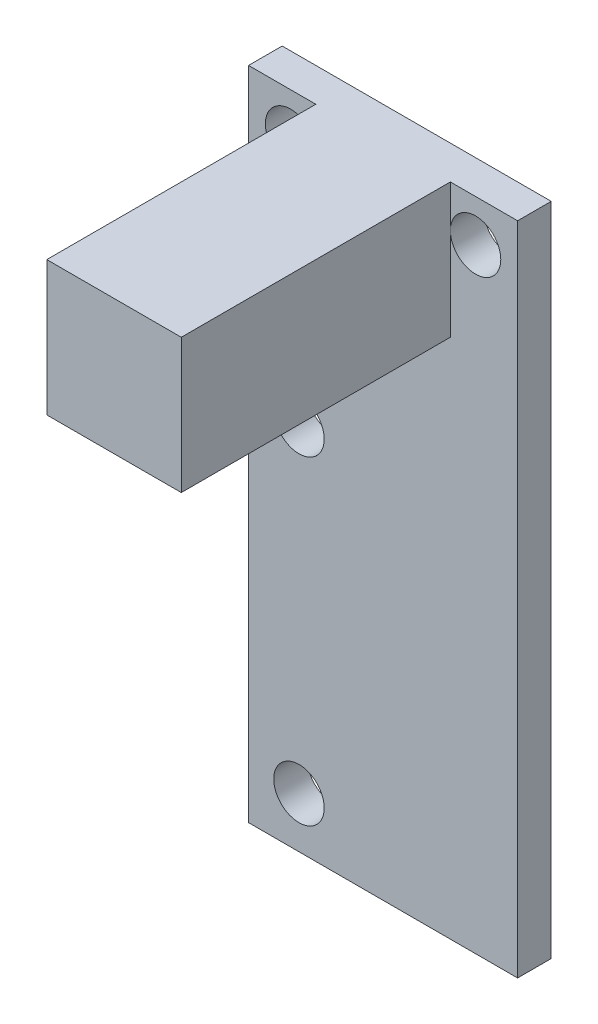
ISO-10303-21;
HEADER;
FILE_DESCRIPTION(('STEP AP214'),'2;1');
FILE_NAME('part.step','',(''),(''),'','','');
FILE_SCHEMA(('AUTOMOTIVE_DESIGN { 1 0 10303 214 1 1 1 1 }'));
ENDSEC;
DATA;
#1=APPLICATION_CONTEXT('core data for automotive mechanical design processes');
#2=APPLICATION_PROTOCOL_DEFINITION('international standard','automotive_design',2000,#1);
#3=PRODUCT_CONTEXT('',#1,'mechanical');
#4=PRODUCT('Part','Part','',(#3));
#5=PRODUCT_RELATED_PRODUCT_CATEGORY('part','',(#4));
#6=PRODUCT_DEFINITION_FORMATION('','',#4);
#7=PRODUCT_DEFINITION_CONTEXT('part definition',#1,'design');
#8=PRODUCT_DEFINITION('design','',#6,#7);
#9=PRODUCT_DEFINITION_SHAPE('','',#8);
#10=(LENGTH_UNIT() NAMED_UNIT(*) SI_UNIT(.MILLI.,.METRE.));
#11=(NAMED_UNIT(*) PLANE_ANGLE_UNIT() SI_UNIT($,.RADIAN.));
#12=(NAMED_UNIT(*) SI_UNIT($,.STERADIAN.) SOLID_ANGLE_UNIT());
#13=UNCERTAINTY_MEASURE_WITH_UNIT(LENGTH_MEASURE(1.E-05),#10,'distance_accuracy_value','');
#14=(GEOMETRIC_REPRESENTATION_CONTEXT(3) GLOBAL_UNCERTAINTY_ASSIGNED_CONTEXT((#13)) GLOBAL_UNIT_ASSIGNED_CONTEXT((#10,
#11,#12)) REPRESENTATION_CONTEXT('',''));
#15=CARTESIAN_POINT('',(0.,0.,0.));
#16=DIRECTION('',(0.,0.,1.));
#17=DIRECTION('',(1.,0.,0.));
#18=AXIS2_PLACEMENT_3D('',#15,#16,#17);
#19=CARTESIAN_POINT('',(16.,0.,0.));
#20=DIRECTION('',(1.,0.,0.));
#21=DIRECTION('',(0.,0.,-1.));
#22=AXIS2_PLACEMENT_3D('',#19,#20,#21);
#23=PLANE('',#22);
#24=DIRECTION('',(0.,1.,0.));
#25=VECTOR('',#24,1.);
#26=CARTESIAN_POINT('',(16.,0.,2.));
#27=LINE('',#26,#25);
#28=CARTESIAN_POINT('',(16.,0.,2.));
#29=VERTEX_POINT('',#28);
#30=CARTESIAN_POINT('',(16.,39.,2.));
#31=VERTEX_POINT('',#30);
#32=EDGE_CURVE('E128',#29,#31,#27,.T.);
#33=ORIENTED_EDGE('',*,*,#32,.F.);
#34=DIRECTION('',(0.,0.,1.));
#35=VECTOR('',#34,1.);
#36=CARTESIAN_POINT('',(16.,0.,0.));
#37=LINE('',#36,#35);
#38=CARTESIAN_POINT('',(16.,0.,0.));
#39=VERTEX_POINT('',#38);
#40=EDGE_CURVE('E11',#39,#29,#37,.T.);
#41=ORIENTED_EDGE('',*,*,#40,.F.);
#42=DIRECTION('',(0.,1.,0.));
#43=VECTOR('',#42,1.);
#44=CARTESIAN_POINT('',(16.,0.,0.));
#45=LINE('',#44,#43);
#46=CARTESIAN_POINT('',(16.,39.,0.));
#47=VERTEX_POINT('',#46);
#48=EDGE_CURVE('E139',#39,#47,#45,.T.);
#49=ORIENTED_EDGE('',*,*,#48,.T.);
#50=DIRECTION('',(0.,0.,1.));
#51=VECTOR('',#50,1.);
#52=CARTESIAN_POINT('',(16.,39.,0.));
#53=LINE('',#52,#51);
#54=EDGE_CURVE('E151',#47,#31,#53,.T.);
#55=ORIENTED_EDGE('',*,*,#54,.T.);
#56=EDGE_LOOP('',(#33,#41,#49,#55));
#57=FACE_BOUND('',#56,.T.);
#58=ADVANCED_FACE('F32',(#57),#23,.T.);
#59=CARTESIAN_POINT('',(0.,0.,0.));
#60=DIRECTION('',(0.,-1.,0.));
#61=DIRECTION('',(0.,0.,-1.));
#62=AXIS2_PLACEMENT_3D('',#59,#60,#61);
#63=PLANE('',#62);
#64=DIRECTION('',(1.,0.,0.));
#65=VECTOR('',#64,1.);
#66=CARTESIAN_POINT('',(0.,0.,2.));
#67=LINE('',#66,#65);
#68=CARTESIAN_POINT('',(0.,0.,2.));
#69=VERTEX_POINT('',#68);
#70=EDGE_CURVE('E143',#69,#29,#67,.T.);
#71=ORIENTED_EDGE('',*,*,#70,.F.);
#72=DIRECTION('',(0.,0.,1.));
#73=VECTOR('',#72,1.);
#74=CARTESIAN_POINT('',(0.,0.,0.));
#75=LINE('',#74,#73);
#76=CARTESIAN_POINT('',(0.,0.,0.));
#77=VERTEX_POINT('',#76);
#78=EDGE_CURVE('E41',#77,#69,#75,.T.);
#79=ORIENTED_EDGE('',*,*,#78,.F.);
#80=DIRECTION('',(1.,0.,0.));
#81=VECTOR('',#80,1.);
#82=CARTESIAN_POINT('',(0.,0.,0.));
#83=LINE('',#82,#81);
#84=EDGE_CURVE('E149',#77,#39,#83,.T.);
#85=ORIENTED_EDGE('',*,*,#84,.T.);
#86=ORIENTED_EDGE('',*,*,#40,.T.);
#87=EDGE_LOOP('',(#71,#79,#85,#86));
#88=FACE_BOUND('',#87,.T.);
#89=ADVANCED_FACE('F178',(#88),#63,.T.);
#90=CARTESIAN_POINT('',(0.,39.,0.));
#91=DIRECTION('',(-1.,0.,0.));
#92=DIRECTION('',(0.,-1.,0.));
#93=AXIS2_PLACEMENT_3D('',#90,#91,#92);
#94=PLANE('',#93);
#95=DIRECTION('',(0.,-1.,0.));
#96=VECTOR('',#95,1.);
#97=CARTESIAN_POINT('',(0.,39.,2.));
#98=LINE('',#97,#96);
#99=CARTESIAN_POINT('',(0.,39.,2.));
#100=VERTEX_POINT('',#99);
#101=EDGE_CURVE('E155',#100,#69,#98,.T.);
#102=ORIENTED_EDGE('',*,*,#101,.F.);
#103=DIRECTION('',(0.,0.,1.));
#104=VECTOR('',#103,1.);
#105=CARTESIAN_POINT('',(0.,39.,0.));
#106=LINE('',#105,#104);
#107=CARTESIAN_POINT('',(0.,39.,0.));
#108=VERTEX_POINT('',#107);
#109=EDGE_CURVE('E165',#108,#100,#106,.T.);
#110=ORIENTED_EDGE('',*,*,#109,.F.);
#111=DIRECTION('',(0.,-1.,0.));
#112=VECTOR('',#111,1.);
#113=CARTESIAN_POINT('',(0.,39.,0.));
#114=LINE('',#113,#112);
#115=EDGE_CURVE('E146',#108,#77,#114,.T.);
#116=ORIENTED_EDGE('',*,*,#115,.T.);
#117=ORIENTED_EDGE('',*,*,#78,.T.);
#118=EDGE_LOOP('',(#102,#110,#116,#117));
#119=FACE_BOUND('',#118,.T.);
#120=ADVANCED_FACE('F250',(#119),#94,.T.);
#121=CARTESIAN_POINT('',(16.,39.,0.));
#122=DIRECTION('',(0.,1.,0.));
#123=DIRECTION('',(0.,0.,1.));
#124=AXIS2_PLACEMENT_3D('',#121,#122,#123);
#125=PLANE('',#124);
#126=DIRECTION('',(-1.,0.,0.));
#127=VECTOR('',#126,1.);
#128=CARTESIAN_POINT('',(16.,39.,2.));
#129=LINE('',#128,#127);
#130=CARTESIAN_POINT('',(12.,39.,2.));
#131=VERTEX_POINT('',#130);
#132=EDGE_CURVE('E161',#31,#131,#129,.T.);
#133=ORIENTED_EDGE('',*,*,#132,.F.);
#134=ORIENTED_EDGE('',*,*,#54,.F.);
#135=DIRECTION('',(-1.,0.,0.));
#136=VECTOR('',#135,1.);
#137=CARTESIAN_POINT('',(16.,39.,0.));
#138=LINE('',#137,#136);
#139=EDGE_CURVE('E142',#47,#108,#138,.T.);
#140=ORIENTED_EDGE('',*,*,#139,.T.);
#141=ORIENTED_EDGE('',*,*,#109,.T.);
#142=CARTESIAN_POINT('',(3.99999999999999,39.,2.));
#143=VERTEX_POINT('',#142);
#144=EDGE_CURVE('E131',#143,#100,#129,.T.);
#145=ORIENTED_EDGE('',*,*,#144,.F.);
#146=DIRECTION('',(0.,0.,-1.));
#147=VECTOR('',#146,1.);
#148=CARTESIAN_POINT('',(3.99999999999999,39.,18.));
#149=LINE('',#148,#147);
#150=CARTESIAN_POINT('',(3.99999999999999,39.,18.));
#151=VERTEX_POINT('',#150);
#152=EDGE_CURVE('E133',#151,#143,#149,.T.);
#153=ORIENTED_EDGE('',*,*,#152,.F.);
#154=DIRECTION('',(-1.,0.,0.));
#155=VECTOR('',#154,1.);
#156=CARTESIAN_POINT('',(3.99999999999999,39.,18.));
#157=LINE('',#156,#155);
#158=CARTESIAN_POINT('',(12.,39.,18.));
#159=VERTEX_POINT('',#158);
#160=EDGE_CURVE('E113',#159,#151,#157,.T.);
#161=ORIENTED_EDGE('',*,*,#160,.F.);
#162=DIRECTION('',(0.,0.,-1.));
#163=VECTOR('',#162,1.);
#164=CARTESIAN_POINT('',(12.,39.,18.));
#165=LINE('',#164,#163);
#166=EDGE_CURVE('E110',#159,#131,#165,.T.);
#167=ORIENTED_EDGE('',*,*,#166,.T.);
#168=EDGE_LOOP('',(#133,#134,#140,#141,#145,#153,#161,#167));
#169=FACE_BOUND('',#168,.T.);
#170=ADVANCED_FACE('F187',(#169),#125,.T.);
#171=CARTESIAN_POINT('',(16.,39.,0.));
#172=DIRECTION('',(0.,0.,1.));
#173=DIRECTION('',(1.,0.,0.));
#174=AXIS2_PLACEMENT_3D('',#171,#172,#173);
#175=PLANE('',#174);
#176=CARTESIAN_POINT('',(3.,22.,0.));
#177=DIRECTION('',(0.,0.,1.));
#178=DIRECTION('',(1.,0.,0.));
#179=AXIS2_PLACEMENT_3D('',#176,#177,#178);
#180=CIRCLE('',#179,1.50000000000001);
#181=CARTESIAN_POINT('',(4.50000000000001,22.,0.));
#182=VERTEX_POINT('',#181);
#183=EDGE_CURVE('E362',#182,#182,#180,.T.);
#184=ORIENTED_EDGE('',*,*,#183,.T.);
#185=EDGE_LOOP('',(#184));
#186=FACE_BOUND('',#185,.T.);
#187=CARTESIAN_POINT('',(2.5,36.5,0.));
#188=DIRECTION('',(0.,0.,1.));
#189=DIRECTION('',(1.,0.,0.));
#190=AXIS2_PLACEMENT_3D('',#187,#188,#189);
#191=CIRCLE('',#190,1.50000000000001);
#192=CARTESIAN_POINT('',(4.00000000000001,36.5,0.));
#193=VERTEX_POINT('',#192);
#194=EDGE_CURVE('E208',#193,#193,#191,.T.);
#195=ORIENTED_EDGE('',*,*,#194,.T.);
#196=EDGE_LOOP('',(#195));
#197=FACE_BOUND('',#196,.T.);
#198=CARTESIAN_POINT('',(13.5,36.5,0.));
#199=DIRECTION('',(0.,0.,1.));
#200=DIRECTION('',(1.,0.,0.));
#201=AXIS2_PLACEMENT_3D('',#198,#199,#200);
#202=CIRCLE('',#201,1.50000000000001);
#203=CARTESIAN_POINT('',(15.,36.5,0.));
#204=VERTEX_POINT('',#203);
#205=EDGE_CURVE('E207',#204,#204,#202,.T.);
#206=ORIENTED_EDGE('',*,*,#205,.T.);
#207=EDGE_LOOP('',(#206));
#208=FACE_BOUND('',#207,.T.);
#209=CARTESIAN_POINT('',(3.,3.,0.));
#210=DIRECTION('',(0.,0.,1.));
#211=DIRECTION('',(1.,0.,0.));
#212=AXIS2_PLACEMENT_3D('',#209,#210,#211);
#213=CIRCLE('',#212,1.50000000000001);
#214=CARTESIAN_POINT('',(4.50000000000001,3.,0.));
#215=VERTEX_POINT('',#214);
#216=EDGE_CURVE('E193',#215,#215,#213,.T.);
#217=ORIENTED_EDGE('',*,*,#216,.T.);
#218=EDGE_LOOP('',(#217));
#219=FACE_BOUND('',#218,.T.);
#220=ORIENTED_EDGE('',*,*,#48,.F.);
#221=ORIENTED_EDGE('',*,*,#84,.F.);
#222=ORIENTED_EDGE('',*,*,#115,.F.);
#223=ORIENTED_EDGE('',*,*,#139,.F.);
#224=EDGE_LOOP('',(#220,#221,#222,#223));
#225=FACE_BOUND('',#224,.T.);
#226=ADVANCED_FACE('F224',(#186,#197,#208,#219,#225),#175,.F.);
#227=CARTESIAN_POINT('',(16.,39.,2.));
#228=DIRECTION('',(0.,0.,1.));
#229=DIRECTION('',(1.,0.,0.));
#230=AXIS2_PLACEMENT_3D('',#227,#228,#229);
#231=PLANE('',#230);
#232=CARTESIAN_POINT('',(3.,22.,2.));
#233=DIRECTION('',(0.,0.,1.));
#234=DIRECTION('',(1.,0.,0.));
#235=AXIS2_PLACEMENT_3D('',#232,#233,#234);
#236=CIRCLE('',#235,1.50000000000001);
#237=CARTESIAN_POINT('',(4.50000000000001,22.,2.));
#238=VERTEX_POINT('',#237);
#239=EDGE_CURVE('E364',#238,#238,#236,.T.);
#240=ORIENTED_EDGE('',*,*,#239,.F.);
#241=EDGE_LOOP('',(#240));
#242=FACE_BOUND('',#241,.T.);
#243=CARTESIAN_POINT('',(3.,3.,2.));
#244=DIRECTION('',(0.,0.,1.));
#245=DIRECTION('',(1.,0.,0.));
#246=AXIS2_PLACEMENT_3D('',#243,#244,#245);
#247=CIRCLE('',#246,1.50000000000001);
#248=CARTESIAN_POINT('',(4.50000000000001,3.,2.));
#249=VERTEX_POINT('',#248);
#250=EDGE_CURVE('E211',#249,#249,#247,.T.);
#251=ORIENTED_EDGE('',*,*,#250,.F.);
#252=EDGE_LOOP('',(#251));
#253=FACE_BOUND('',#252,.T.);
#254=DIRECTION('',(0.,-1.,0.));
#255=VECTOR('',#254,1.);
#256=CARTESIAN_POINT('',(4.,31.,2.));
#257=LINE('',#256,#255);
#258=CARTESIAN_POINT('',(3.99999999999999,36.5,2.));
#259=VERTEX_POINT('',#258);
#260=CARTESIAN_POINT('',(4.,31.,2.));
#261=VERTEX_POINT('',#260);
#262=EDGE_CURVE('E35',#259,#261,#257,.T.);
#263=ORIENTED_EDGE('',*,*,#262,.F.);
#264=CARTESIAN_POINT('',(2.5,36.5,2.));
#265=DIRECTION('',(0.,0.,1.));
#266=DIRECTION('',(1.,0.,0.));
#267=AXIS2_PLACEMENT_3D('',#264,#265,#266);
#268=CIRCLE('',#267,1.50000000000001);
#269=EDGE_CURVE('E47',#259,#259,#268,.T.);
#270=ORIENTED_EDGE('',*,*,#269,.F.);
#271=EDGE_CURVE('E123',#143,#259,#257,.T.);
#272=ORIENTED_EDGE('',*,*,#271,.F.);
#273=ORIENTED_EDGE('',*,*,#144,.T.);
#274=ORIENTED_EDGE('',*,*,#101,.T.);
#275=ORIENTED_EDGE('',*,*,#70,.T.);
#276=ORIENTED_EDGE('',*,*,#32,.T.);
#277=ORIENTED_EDGE('',*,*,#132,.T.);
#278=DIRECTION('',(0.,1.,0.));
#279=VECTOR('',#278,1.);
#280=CARTESIAN_POINT('',(12.,39.,2.));
#281=LINE('',#280,#279);
#282=CARTESIAN_POINT('',(12.,36.5,2.));
#283=VERTEX_POINT('',#282);
#284=EDGE_CURVE('E185',#283,#131,#281,.T.);
#285=ORIENTED_EDGE('',*,*,#284,.F.);
#286=CARTESIAN_POINT('',(13.5,36.5,2.));
#287=DIRECTION('',(0.,0.,1.));
#288=DIRECTION('',(1.,0.,0.));
#289=AXIS2_PLACEMENT_3D('',#286,#287,#288);
#290=CIRCLE('',#289,1.50000000000001);
#291=EDGE_CURVE('E52',#283,#283,#290,.T.);
#292=ORIENTED_EDGE('',*,*,#291,.F.);
#293=CARTESIAN_POINT('',(12.,31.,2.));
#294=VERTEX_POINT('',#293);
#295=EDGE_CURVE('E196',#294,#283,#281,.T.);
#296=ORIENTED_EDGE('',*,*,#295,.F.);
#297=DIRECTION('',(1.,0.,0.));
#298=VECTOR('',#297,1.);
#299=CARTESIAN_POINT('',(12.,31.,2.));
#300=LINE('',#299,#298);
#301=EDGE_CURVE('E127',#261,#294,#300,.T.);
#302=ORIENTED_EDGE('',*,*,#301,.F.);
#303=EDGE_LOOP('',(#263,#270,#272,#273,#274,#275,#276,#277,#285,#292,#296,#302));
#304=FACE_BOUND('',#303,.T.);
#305=ADVANCED_FACE('F174',(#242,#253,#304),#231,.T.);
#306=CARTESIAN_POINT('',(12.,31.,18.));
#307=DIRECTION('',(0.,1.,0.));
#308=DIRECTION('',(0.,0.,1.));
#309=AXIS2_PLACEMENT_3D('',#306,#307,#308);
#310=PLANE('',#309);
#311=ORIENTED_EDGE('',*,*,#301,.T.);
#312=DIRECTION('',(0.,0.,-1.));
#313=VECTOR('',#312,1.);
#314=CARTESIAN_POINT('',(12.,31.,18.));
#315=LINE('',#314,#313);
#316=CARTESIAN_POINT('',(12.,31.,18.));
#317=VERTEX_POINT('',#316);
#318=EDGE_CURVE('E107',#317,#294,#315,.T.);
#319=ORIENTED_EDGE('',*,*,#318,.F.);
#320=DIRECTION('',(1.,0.,0.));
#321=VECTOR('',#320,1.);
#322=CARTESIAN_POINT('',(12.,31.,18.));
#323=LINE('',#322,#321);
#324=CARTESIAN_POINT('',(4.,31.,18.));
#325=VERTEX_POINT('',#324);
#326=EDGE_CURVE('E114',#325,#317,#323,.T.);
#327=ORIENTED_EDGE('',*,*,#326,.F.);
#328=DIRECTION('',(0.,0.,-1.));
#329=VECTOR('',#328,1.);
#330=CARTESIAN_POINT('',(4.,31.,18.));
#331=LINE('',#330,#329);
#332=EDGE_CURVE('E137',#325,#261,#331,.T.);
#333=ORIENTED_EDGE('',*,*,#332,.T.);
#334=EDGE_LOOP('',(#311,#319,#327,#333));
#335=FACE_BOUND('',#334,.T.);
#336=ADVANCED_FACE('F125',(#335),#310,.F.);
#337=CARTESIAN_POINT('',(12.,39.,18.));
#338=DIRECTION('',(-1.,0.,0.));
#339=DIRECTION('',(0.,-1.,0.));
#340=AXIS2_PLACEMENT_3D('',#337,#338,#339);
#341=PLANE('',#340);
#342=ORIENTED_EDGE('',*,*,#295,.T.);
#343=ORIENTED_EDGE('',*,*,#284,.T.);
#344=ORIENTED_EDGE('',*,*,#166,.F.);
#345=DIRECTION('',(0.,1.,0.));
#346=VECTOR('',#345,1.);
#347=CARTESIAN_POINT('',(12.,39.,18.));
#348=LINE('',#347,#346);
#349=EDGE_CURVE('E102',#317,#159,#348,.T.);
#350=ORIENTED_EDGE('',*,*,#349,.F.);
#351=ORIENTED_EDGE('',*,*,#318,.T.);
#352=EDGE_LOOP('',(#342,#343,#344,#350,#351));
#353=FACE_BOUND('',#352,.T.);
#354=ADVANCED_FACE('F105',(#353),#341,.F.);
#355=CARTESIAN_POINT('',(4.,31.,18.));
#356=DIRECTION('',(1.,0.,0.));
#357=DIRECTION('',(0.,1.,0.));
#358=AXIS2_PLACEMENT_3D('',#355,#356,#357);
#359=PLANE('',#358);
#360=ORIENTED_EDGE('',*,*,#271,.T.);
#361=ORIENTED_EDGE('',*,*,#262,.T.);
#362=ORIENTED_EDGE('',*,*,#332,.F.);
#363=DIRECTION('',(0.,-1.,0.));
#364=VECTOR('',#363,1.);
#365=CARTESIAN_POINT('',(4.,31.,18.));
#366=LINE('',#365,#364);
#367=EDGE_CURVE('E119',#151,#325,#366,.T.);
#368=ORIENTED_EDGE('',*,*,#367,.F.);
#369=ORIENTED_EDGE('',*,*,#152,.T.);
#370=EDGE_LOOP('',(#360,#361,#362,#368,#369));
#371=FACE_BOUND('',#370,.T.);
#372=ADVANCED_FACE('F309',(#371),#359,.F.);
#373=CARTESIAN_POINT('',(4.,31.,18.));
#374=DIRECTION('',(0.,0.,-1.));
#375=DIRECTION('',(-1.,0.,0.));
#376=AXIS2_PLACEMENT_3D('',#373,#374,#375);
#377=PLANE('',#376);
#378=ORIENTED_EDGE('',*,*,#326,.T.);
#379=ORIENTED_EDGE('',*,*,#349,.T.);
#380=ORIENTED_EDGE('',*,*,#160,.T.);
#381=ORIENTED_EDGE('',*,*,#367,.T.);
#382=EDGE_LOOP('',(#378,#379,#380,#381));
#383=FACE_BOUND('',#382,.T.);
#384=ADVANCED_FACE('F117',(#383),#377,.F.);
#385=CARTESIAN_POINT('',(3.,3.,2.));
#386=DIRECTION('',(0.,0.,1.));
#387=DIRECTION('',(1.,0.,0.));
#388=AXIS2_PLACEMENT_3D('',#385,#386,#387);
#389=CYLINDRICAL_SURFACE('',#388,1.50000000000001);
#390=ORIENTED_EDGE('',*,*,#216,.F.);
#391=EDGE_LOOP('',(#390));
#392=FACE_BOUND('',#391,.T.);
#393=ORIENTED_EDGE('',*,*,#250,.T.);
#394=EDGE_LOOP('',(#393));
#395=FACE_BOUND('',#394,.T.);
#396=ADVANCED_FACE('F227',(#392,#395),#389,.F.);
#397=CARTESIAN_POINT('',(13.5,36.5,2.));
#398=DIRECTION('',(0.,0.,1.));
#399=DIRECTION('',(1.,0.,0.));
#400=AXIS2_PLACEMENT_3D('',#397,#398,#399);
#401=CYLINDRICAL_SURFACE('',#400,1.50000000000001);
#402=ORIENTED_EDGE('',*,*,#205,.F.);
#403=EDGE_LOOP('',(#402));
#404=FACE_BOUND('',#403,.T.);
#405=ORIENTED_EDGE('',*,*,#291,.T.);
#406=EDGE_LOOP('',(#405));
#407=FACE_BOUND('',#406,.T.);
#408=ADVANCED_FACE('F230',(#404,#407),#401,.F.);
#409=CARTESIAN_POINT('',(2.5,36.5,2.));
#410=DIRECTION('',(0.,0.,1.));
#411=DIRECTION('',(1.,0.,0.));
#412=AXIS2_PLACEMENT_3D('',#409,#410,#411);
#413=CYLINDRICAL_SURFACE('',#412,1.50000000000001);
#414=ORIENTED_EDGE('',*,*,#194,.F.);
#415=EDGE_LOOP('',(#414));
#416=FACE_BOUND('',#415,.T.);
#417=ORIENTED_EDGE('',*,*,#269,.T.);
#418=EDGE_LOOP('',(#417));
#419=FACE_BOUND('',#418,.T.);
#420=ADVANCED_FACE('F272',(#416,#419),#413,.F.);
#421=CARTESIAN_POINT('',(3.,22.,2.));
#422=DIRECTION('',(0.,0.,1.));
#423=DIRECTION('',(1.,0.,0.));
#424=AXIS2_PLACEMENT_3D('',#421,#422,#423);
#425=CYLINDRICAL_SURFACE('',#424,1.50000000000001);
#426=ORIENTED_EDGE('',*,*,#183,.F.);
#427=EDGE_LOOP('',(#426));
#428=FACE_BOUND('',#427,.T.);
#429=ORIENTED_EDGE('',*,*,#239,.T.);
#430=EDGE_LOOP('',(#429));
#431=FACE_BOUND('',#430,.T.);
#432=ADVANCED_FACE('F281',(#428,#431),#425,.F.);
#433=CLOSED_SHELL('',(#58,#89,#120,#170,#226,#305,#336,#354,#372,#384,#396,#408,#420,#432));
#434=MANIFOLD_SOLID_BREP('B2',#433);
#435=ADVANCED_BREP_SHAPE_REPRESENTATION('',(#18,#434),#14);
#436=SHAPE_DEFINITION_REPRESENTATION(#9,#435);
ENDSEC;
END-ISO-10303-21;
